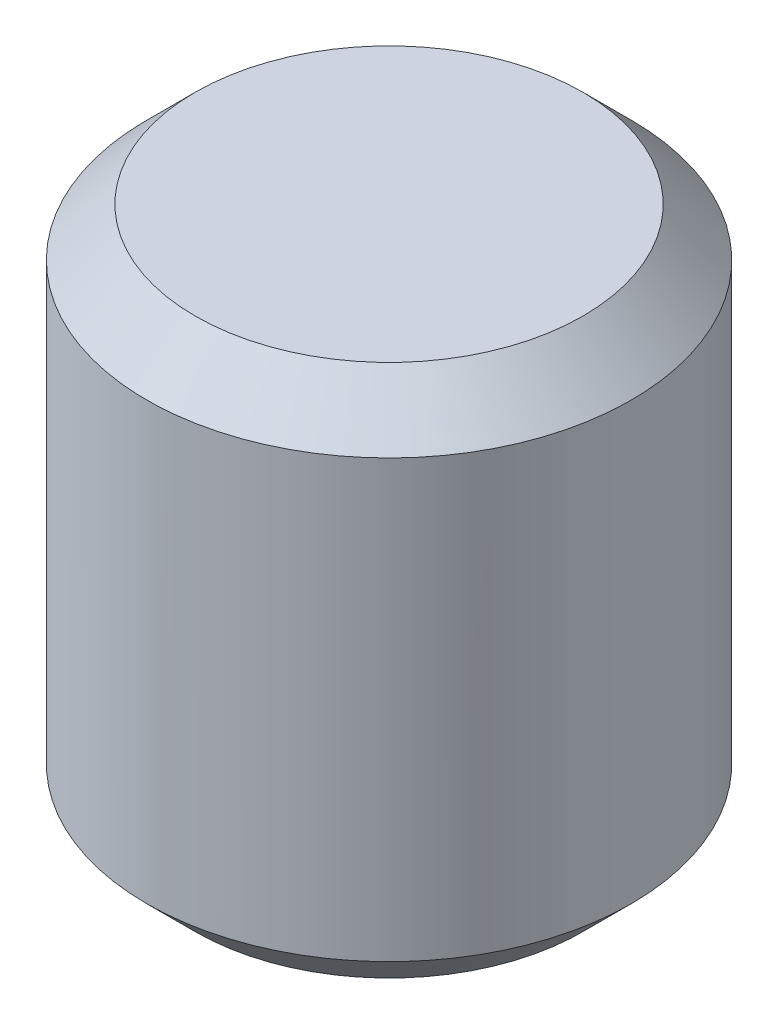
ISO-10303-21;
HEADER;
FILE_DESCRIPTION(('STEP AP214'),'2;1');
FILE_NAME('part.step','',(''),(''),'','','');
FILE_SCHEMA(('AUTOMOTIVE_DESIGN { 1 0 10303 214 1 1 1 1 }'));
ENDSEC;
DATA;
#1=APPLICATION_CONTEXT('core data for automotive mechanical design processes');
#2=APPLICATION_PROTOCOL_DEFINITION('international standard','automotive_design',2000,#1);
#3=PRODUCT_CONTEXT('',#1,'mechanical');
#4=PRODUCT('Part','Part','',(#3));
#5=PRODUCT_RELATED_PRODUCT_CATEGORY('part','',(#4));
#6=PRODUCT_DEFINITION_FORMATION('','',#4);
#7=PRODUCT_DEFINITION_CONTEXT('part definition',#1,'design');
#8=PRODUCT_DEFINITION('design','',#6,#7);
#9=PRODUCT_DEFINITION_SHAPE('','',#8);
#10=(LENGTH_UNIT() NAMED_UNIT(*) SI_UNIT(.MILLI.,.METRE.));
#11=(NAMED_UNIT(*) PLANE_ANGLE_UNIT() SI_UNIT($,.RADIAN.));
#12=(NAMED_UNIT(*) SI_UNIT($,.STERADIAN.) SOLID_ANGLE_UNIT());
#13=UNCERTAINTY_MEASURE_WITH_UNIT(LENGTH_MEASURE(1.E-05),#10,'distance_accuracy_value','');
#14=(GEOMETRIC_REPRESENTATION_CONTEXT(3) GLOBAL_UNCERTAINTY_ASSIGNED_CONTEXT((#13)) GLOBAL_UNIT_ASSIGNED_CONTEXT((#10,
#11,#12)) REPRESENTATION_CONTEXT('',''));
#15=CARTESIAN_POINT('',(0.,0.,0.));
#16=DIRECTION('',(0.,0.,1.));
#17=DIRECTION('',(1.,0.,0.));
#18=AXIS2_PLACEMENT_3D('',#15,#16,#17);
#19=CARTESIAN_POINT('',(0.,3.85,0.));
#20=DIRECTION('',(0.,-1.,0.));
#21=DIRECTION('',(0.,0.,-1.));
#22=AXIS2_PLACEMENT_3D('',#19,#20,#21);
#23=CYLINDRICAL_SURFACE('',#22,1.75);
#24=CARTESIAN_POINT('',(0.,3.5,0.));
#25=DIRECTION('',(0.,1.,0.));
#26=DIRECTION('',(0.,0.,1.));
#27=AXIS2_PLACEMENT_3D('',#24,#25,#26);
#28=CIRCLE('',#27,1.75);
#29=CARTESIAN_POINT('',(0.,3.5,-1.75));
#30=VERTEX_POINT('',#29);
#31=EDGE_CURVE('E54',#30,#30,#28,.F.);
#32=CARTESIAN_POINT('',(0.,0.350000000000004,0.));
#33=DIRECTION('',(0.,1.,0.));
#34=DIRECTION('',(0.,0.,1.));
#35=AXIS2_PLACEMENT_3D('',#32,#33,#34);
#36=CIRCLE('',#35,1.75);
#37=CARTESIAN_POINT('',(0.,0.350000000000004,-1.75));
#38=VERTEX_POINT('',#37);
#39=EDGE_CURVE('E59',#38,#38,#36,.T.);
#40=CARTESIAN_POINT('',(0.,3.5,-1.75));
#41=CARTESIAN_POINT('',(0.,3.4671875,-1.75));
#42=CARTESIAN_POINT('',(0.,3.434375,-1.75));
#43=CARTESIAN_POINT('',(0.,3.36875,-1.75));
#44=CARTESIAN_POINT('',(0.,3.3359375,-1.75));
#45=CARTESIAN_POINT('',(0.,3.2703125,-1.75));
#46=CARTESIAN_POINT('',(0.,3.2375,-1.75));
#47=CARTESIAN_POINT('',(0.,3.171875,-1.75));
#48=CARTESIAN_POINT('',(0.,3.1390625,-1.75));
#49=CARTESIAN_POINT('',(0.,3.0734375,-1.75));
#50=CARTESIAN_POINT('',(0.,3.040625,-1.75));
#51=CARTESIAN_POINT('',(0.,2.975,-1.75));
#52=CARTESIAN_POINT('',(0.,2.9421875,-1.75));
#53=CARTESIAN_POINT('',(0.,2.8765625,-1.75));
#54=CARTESIAN_POINT('',(0.,2.84375,-1.75));
#55=CARTESIAN_POINT('',(0.,2.778125,-1.75));
#56=CARTESIAN_POINT('',(0.,2.7453125,-1.75));
#57=CARTESIAN_POINT('',(0.,2.6796875,-1.75));
#58=CARTESIAN_POINT('',(0.,2.646875,-1.75));
#59=CARTESIAN_POINT('',(0.,2.58125,-1.75));
#60=CARTESIAN_POINT('',(0.,2.5484375,-1.75));
#61=CARTESIAN_POINT('',(0.,2.4828125,-1.75));
#62=CARTESIAN_POINT('',(0.,2.45,-1.75));
#63=CARTESIAN_POINT('',(0.,2.384375,-1.75));
#64=CARTESIAN_POINT('',(0.,2.3515625,-1.75));
#65=CARTESIAN_POINT('',(0.,2.2859375,-1.75));
#66=CARTESIAN_POINT('',(0.,2.253125,-1.75));
#67=CARTESIAN_POINT('',(0.,2.1875,-1.75));
#68=CARTESIAN_POINT('',(0.,2.1546875,-1.75));
#69=CARTESIAN_POINT('',(0.,2.0890625,-1.75));
#70=CARTESIAN_POINT('',(0.,2.05625,-1.75));
#71=CARTESIAN_POINT('',(0.,1.990625,-1.75));
#72=CARTESIAN_POINT('',(0.,1.9578125,-1.75));
#73=CARTESIAN_POINT('',(0.,1.8921875,-1.75));
#74=CARTESIAN_POINT('',(0.,1.859375,-1.75));
#75=CARTESIAN_POINT('',(0.,1.79375,-1.75));
#76=CARTESIAN_POINT('',(0.,1.7609375,-1.75));
#77=CARTESIAN_POINT('',(0.,1.6953125,-1.75));
#78=CARTESIAN_POINT('',(0.,1.6625,-1.75));
#79=CARTESIAN_POINT('',(0.,1.596875,-1.75));
#80=CARTESIAN_POINT('',(0.,1.5640625,-1.75));
#81=CARTESIAN_POINT('',(0.,1.4984375,-1.75));
#82=CARTESIAN_POINT('',(0.,1.465625,-1.75));
#83=CARTESIAN_POINT('',(0.,1.4,-1.75));
#84=CARTESIAN_POINT('',(0.,1.3671875,-1.75));
#85=CARTESIAN_POINT('',(0.,1.3015625,-1.75));
#86=CARTESIAN_POINT('',(0.,1.26875,-1.75));
#87=CARTESIAN_POINT('',(0.,1.203125,-1.75));
#88=CARTESIAN_POINT('',(0.,1.1703125,-1.75));
#89=CARTESIAN_POINT('',(0.,1.1046875,-1.75));
#90=CARTESIAN_POINT('',(0.,1.071875,-1.75));
#91=CARTESIAN_POINT('',(0.,1.00625,-1.75));
#92=CARTESIAN_POINT('',(0.,0.973437500000004,-1.75));
#93=CARTESIAN_POINT('',(0.,0.907812500000004,-1.75));
#94=CARTESIAN_POINT('',(0.,0.875000000000004,-1.75));
#95=CARTESIAN_POINT('',(0.,0.809375000000004,-1.75));
#96=CARTESIAN_POINT('',(0.,0.776562500000004,-1.75));
#97=CARTESIAN_POINT('',(0.,0.710937500000004,-1.75));
#98=CARTESIAN_POINT('',(0.,0.678125000000004,-1.75));
#99=CARTESIAN_POINT('',(0.,0.612500000000004,-1.75));
#100=CARTESIAN_POINT('',(0.,0.579687500000004,-1.75));
#101=CARTESIAN_POINT('',(0.,0.514062500000005,-1.75));
#102=CARTESIAN_POINT('',(0.,0.481250000000005,-1.75));
#103=CARTESIAN_POINT('',(0.,0.415625000000005,-1.75));
#104=CARTESIAN_POINT('',(0.,0.382812500000004,-1.75));
#105=CARTESIAN_POINT('',(0.,0.350000000000004,-1.75));
#106=B_SPLINE_CURVE_WITH_KNOTS('',3,(#40,#41,#42,#43,#44,#45,#46,#47,#48,#49,#50,#51,#52,#53,
#54,#55,#56,#57,#58,#59,#60,#61,#62,#63,#64,#65,#66,#67,#68,#69,#70,#71,#72,#73,#74,#75,#76,#77,
#78,#79,#80,#81,#82,#83,#84,#85,#86,#87,#88,#89,#90,#91,#92,#93,#94,#95,#96,#97,#98,#99,#100,
#101,#102,#103,#104,#105),.UNSPECIFIED.,.F.,.F.,(4,2,2,2,2,2,2,2,2,2,2,2,2,2,2,2,2,2,2,2,2,2,2,
2,2,2,2,2,2,2,2,2,4),(0.,0.0984375,0.196875,0.2953125,0.39375,0.4921875,0.590625,
0.689062499999999,0.787499999999999,0.885937499999999,0.984374999999999,1.0828125,1.18125,
1.2796875,1.378125,1.4765625,1.575,1.6734375,1.771875,1.8703125,1.96875,2.0671875,2.165625,
2.2640625,2.3625,2.4609375,2.559375,2.6578125,2.75625,2.8546875,2.953125,3.0515625,3.15),.UNSPECIFIED.);
#107=EDGE_CURVE('BSEAM45',#30,#38,#106,.T.);
#108=ORIENTED_EDGE('',*,*,#31,.T.);
#109=ORIENTED_EDGE('',*,*,#39,.T.);
#110=ORIENTED_EDGE('',*,*,#107,.T.);
#111=ORIENTED_EDGE('',*,*,#107,.F.);
#112=EDGE_LOOP('',(#108,#110,#109,#111));
#113=FACE_BOUND('',#112,.T.);
#114=ADVANCED_FACE('F45',(#113),#23,.T.);
#115=CARTESIAN_POINT('',(0.,3.85,0.));
#116=DIRECTION('',(0.,1.,0.));
#117=DIRECTION('',(0.,0.,1.));
#118=AXIS2_PLACEMENT_3D('',#115,#116,#117);
#119=PLANE('',#118);
#120=CARTESIAN_POINT('',(0.,3.85,0.));
#121=DIRECTION('',(0.,1.,0.));
#122=DIRECTION('',(0.,0.,1.));
#123=AXIS2_PLACEMENT_3D('',#120,#121,#122);
#124=CIRCLE('',#123,1.4);
#125=CARTESIAN_POINT('',(0.,3.85,1.4));
#126=VERTEX_POINT('',#125);
#127=EDGE_CURVE('E64',#126,#126,#124,.T.);
#128=ORIENTED_EDGE('',*,*,#127,.T.);
#129=EDGE_LOOP('',(#128));
#130=FACE_BOUND('',#129,.T.);
#131=ADVANCED_FACE('F71',(#130),#119,.T.);
#132=CARTESIAN_POINT('',(0.,0.,0.));
#133=DIRECTION('',(0.,1.,0.));
#134=DIRECTION('',(0.,0.,1.));
#135=AXIS2_PLACEMENT_3D('',#132,#133,#134);
#136=PLANE('',#135);
#137=CARTESIAN_POINT('',(0.,0.,0.));
#138=DIRECTION('',(0.,1.,0.));
#139=DIRECTION('',(0.,0.,1.));
#140=AXIS2_PLACEMENT_3D('',#137,#138,#139);
#141=CIRCLE('',#140,1.39999999999999);
#142=CARTESIAN_POINT('',(0.,0.,1.39999999999999));
#143=VERTEX_POINT('',#142);
#144=EDGE_CURVE('E10',#143,#143,#141,.F.);
#145=ORIENTED_EDGE('',*,*,#144,.T.);
#146=EDGE_LOOP('',(#145));
#147=FACE_BOUND('',#146,.T.);
#148=ADVANCED_FACE('F75',(#147),#136,.F.);
#149=CARTESIAN_POINT('',(0.,3.85,0.));
#150=DIRECTION('',(0.,-1.,0.));
#151=DIRECTION('',(0.,0.,-1.));
#152=AXIS2_PLACEMENT_3D('',#149,#150,#151);
#153=CONICAL_SURFACE('',#152,1.4,0.785398163397446);
#154=ORIENTED_EDGE('',*,*,#31,.F.);
#155=EDGE_LOOP('',(#154));
#156=FACE_BOUND('',#155,.T.);
#157=ORIENTED_EDGE('',*,*,#127,.F.);
#158=EDGE_LOOP('',(#157));
#159=FACE_BOUND('',#158,.T.);
#160=ADVANCED_FACE('F73',(#156,#159),#153,.T.);
#161=CARTESIAN_POINT('',(0.,0.350000000000004,0.));
#162=DIRECTION('',(0.,1.,0.));
#163=DIRECTION('',(0.,0.,1.));
#164=AXIS2_PLACEMENT_3D('',#161,#162,#163);
#165=CONICAL_SURFACE('',#164,1.75,0.785398163397451);
#166=ORIENTED_EDGE('',*,*,#144,.F.);
#167=EDGE_LOOP('',(#166));
#168=FACE_BOUND('',#167,.T.);
#169=ORIENTED_EDGE('',*,*,#39,.F.);
#170=EDGE_LOOP('',(#169));
#171=FACE_BOUND('',#170,.T.);
#172=ADVANCED_FACE('F48',(#168,#171),#165,.T.);
#173=CLOSED_SHELL('',(#114,#131,#148,#160,#172));
#174=MANIFOLD_SOLID_BREP('B2',#173);
#175=ADVANCED_BREP_SHAPE_REPRESENTATION('',(#18,#174),#14);
#176=SHAPE_DEFINITION_REPRESENTATION(#9,#175);
ENDSEC;
END-ISO-10303-21;
